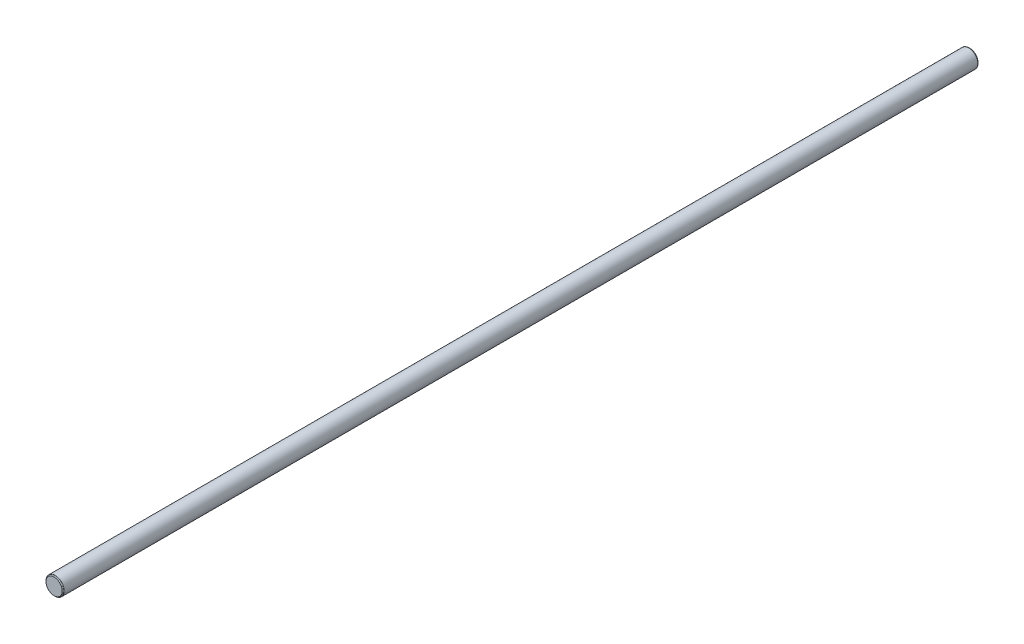
ISO-10303-21;
HEADER;
FILE_DESCRIPTION(('STEP AP214'),'2;1');
FILE_NAME('part.step','',(''),(''),'','','');
FILE_SCHEMA(('AUTOMOTIVE_DESIGN { 1 0 10303 214 1 1 1 1 }'));
ENDSEC;
DATA;
#1=APPLICATION_CONTEXT('core data for automotive mechanical design processes');
#2=APPLICATION_PROTOCOL_DEFINITION('international standard','automotive_design',2000,#1);
#3=PRODUCT_CONTEXT('',#1,'mechanical');
#4=PRODUCT('Part','Part','',(#3));
#5=PRODUCT_RELATED_PRODUCT_CATEGORY('part','',(#4));
#6=PRODUCT_DEFINITION_FORMATION('','',#4);
#7=PRODUCT_DEFINITION_CONTEXT('part definition',#1,'design');
#8=PRODUCT_DEFINITION('design','',#6,#7);
#9=PRODUCT_DEFINITION_SHAPE('','',#8);
#10=(LENGTH_UNIT() NAMED_UNIT(*) SI_UNIT(.MILLI.,.METRE.));
#11=(NAMED_UNIT(*) PLANE_ANGLE_UNIT() SI_UNIT($,.RADIAN.));
#12=(NAMED_UNIT(*) SI_UNIT($,.STERADIAN.) SOLID_ANGLE_UNIT());
#13=UNCERTAINTY_MEASURE_WITH_UNIT(LENGTH_MEASURE(1.E-05),#10,'distance_accuracy_value','');
#14=(GEOMETRIC_REPRESENTATION_CONTEXT(3) GLOBAL_UNCERTAINTY_ASSIGNED_CONTEXT((#13)) GLOBAL_UNIT_ASSIGNED_CONTEXT((#10,
#11,#12)) REPRESENTATION_CONTEXT('',''));
#15=CARTESIAN_POINT('',(0.,0.,0.));
#16=DIRECTION('',(0.,0.,1.));
#17=DIRECTION('',(1.,0.,0.));
#18=AXIS2_PLACEMENT_3D('',#15,#16,#17);
#19=CARTESIAN_POINT('',(0.,0.,152.4));
#20=DIRECTION('',(0.,0.,-1.));
#21=DIRECTION('',(-1.,0.,0.));
#22=AXIS2_PLACEMENT_3D('',#19,#20,#21);
#23=CYLINDRICAL_SURFACE('',#22,3.);
#24=CARTESIAN_POINT('',(0.,0.,-152.006801948466));
#25=DIRECTION('',(0.,0.,-1.));
#26=DIRECTION('',(-1.,0.,0.));
#27=AXIS2_PLACEMENT_3D('',#24,#25,#26);
#28=CIRCLE('',#27,3.);
#29=CARTESIAN_POINT('',(-3.,0.,-152.006801948466));
#30=VERTEX_POINT('',#29);
#31=EDGE_CURVE('E61',#30,#30,#28,.F.);
#32=CARTESIAN_POINT('',(0.,0.,152.006801948466));
#33=DIRECTION('',(0.,0.,1.));
#34=DIRECTION('',(1.,0.,0.));
#35=AXIS2_PLACEMENT_3D('',#32,#33,#34);
#36=CIRCLE('',#35,3.);
#37=CARTESIAN_POINT('',(-3.,0.,152.006801948466));
#38=VERTEX_POINT('',#37);
#39=EDGE_CURVE('E67',#38,#38,#36,.F.);
#40=CARTESIAN_POINT('',(-3.,0.,-152.006801948466));
#41=CARTESIAN_POINT('',(-3.,0.,-148.839993574539));
#42=CARTESIAN_POINT('',(-3.,0.,-145.673185200613));
#43=CARTESIAN_POINT('',(-3.,0.,-139.33956845276));
#44=CARTESIAN_POINT('',(-3.,0.,-136.172760078834));
#45=CARTESIAN_POINT('',(-3.,0.,-129.839143330981));
#46=CARTESIAN_POINT('',(-3.,0.,-126.672334957055));
#47=CARTESIAN_POINT('',(-3.,0.,-120.338718209202));
#48=CARTESIAN_POINT('',(-3.,0.,-117.171909835276));
#49=CARTESIAN_POINT('',(-3.,0.,-110.838293087423));
#50=CARTESIAN_POINT('',(-3.,0.,-107.671484713497));
#51=CARTESIAN_POINT('',(-3.,0.,-101.337867965644));
#52=CARTESIAN_POINT('',(-3.,0.,-98.1710595917174));
#53=CARTESIAN_POINT('',(-3.,0.,-91.8374428438647));
#54=CARTESIAN_POINT('',(-3.,0.,-88.6706344699383));
#55=CARTESIAN_POINT('',(-3.,0.,-82.3370177220855));
#56=CARTESIAN_POINT('',(-3.,0.,-79.1702093481591));
#57=CARTESIAN_POINT('',(-3.,0.,-72.8365926003064));
#58=CARTESIAN_POINT('',(-3.,0.,-69.66978422638));
#59=CARTESIAN_POINT('',(-3.,0.,-63.3361674785273));
#60=CARTESIAN_POINT('',(-3.,0.,-60.1693591046009));
#61=CARTESIAN_POINT('',(-3.,0.,-53.8357423567481));
#62=CARTESIAN_POINT('',(-3.,0.,-50.6689339828218));
#63=CARTESIAN_POINT('',(-3.,0.,-44.335317234969));
#64=CARTESIAN_POINT('',(-3.,0.,-41.1685088610426));
#65=CARTESIAN_POINT('',(-3.,0.,-34.8348921131899));
#66=CARTESIAN_POINT('',(-3.,0.,-31.6680837392635));
#67=CARTESIAN_POINT('',(-3.,0.,-25.3344669914108));
#68=CARTESIAN_POINT('',(-3.,0.,-22.1676586174844));
#69=CARTESIAN_POINT('',(-3.,0.,-15.8340418696316));
#70=CARTESIAN_POINT('',(-3.,0.,-12.6672334957053));
#71=CARTESIAN_POINT('',(-3.,0.,-6.33361674785252));
#72=CARTESIAN_POINT('',(-3.,0.,-3.16680837392615));
#73=CARTESIAN_POINT('',(-3.,0.,3.1668083739266));
#74=CARTESIAN_POINT('',(-3.,0.,6.33361674785297));
#75=CARTESIAN_POINT('',(-3.,0.,12.6672334957057));
#76=CARTESIAN_POINT('',(-3.,0.,15.8340418696321));
#77=CARTESIAN_POINT('',(-3.,0.,22.1676586174848));
#78=CARTESIAN_POINT('',(-3.,0.,25.3344669914112));
#79=CARTESIAN_POINT('',(-3.,0.,31.6680837392639));
#80=CARTESIAN_POINT('',(-3.,0.,34.8348921131903));
#81=CARTESIAN_POINT('',(-3.,0.,41.1685088610431));
#82=CARTESIAN_POINT('',(-3.,0.,44.3353172349695));
#83=CARTESIAN_POINT('',(-3.,0.,50.6689339828222));
#84=CARTESIAN_POINT('',(-3.,0.,53.8357423567486));
#85=CARTESIAN_POINT('',(-3.,0.,60.1693591046013));
#86=CARTESIAN_POINT('',(-3.,0.,63.3361674785277));
#87=CARTESIAN_POINT('',(-3.,0.,69.6697842263805));
#88=CARTESIAN_POINT('',(-3.,0.,72.8365926003068));
#89=CARTESIAN_POINT('',(-3.,0.,79.1702093481596));
#90=CARTESIAN_POINT('',(-3.,0.,82.337017722086));
#91=CARTESIAN_POINT('',(-3.,0.,88.6706344699387));
#92=CARTESIAN_POINT('',(-3.,0.,91.8374428438651));
#93=CARTESIAN_POINT('',(-3.,0.,98.1710595917178));
#94=CARTESIAN_POINT('',(-3.,0.,101.337867965644));
#95=CARTESIAN_POINT('',(-3.,0.,107.671484713497));
#96=CARTESIAN_POINT('',(-3.,0.,110.838293087423));
#97=CARTESIAN_POINT('',(-3.,0.,117.171909835276));
#98=CARTESIAN_POINT('',(-3.,0.,120.338718209202));
#99=CARTESIAN_POINT('',(-3.,0.,126.672334957055));
#100=CARTESIAN_POINT('',(-3.,0.,129.839143330982));
#101=CARTESIAN_POINT('',(-3.,0.,136.172760078834));
#102=CARTESIAN_POINT('',(-3.,0.,139.339568452761));
#103=CARTESIAN_POINT('',(-3.,0.,145.673185200613));
#104=CARTESIAN_POINT('',(-3.,0.,148.83999357454));
#105=CARTESIAN_POINT('',(-3.,0.,152.006801948466));
#106=B_SPLINE_CURVE_WITH_KNOTS('',3,(#40,#41,#42,#43,#44,#45,#46,#47,#48,#49,#50,#51,#52,#53,
#54,#55,#56,#57,#58,#59,#60,#61,#62,#63,#64,#65,#66,#67,#68,#69,#70,#71,#72,#73,#74,#75,#76,#77,
#78,#79,#80,#81,#82,#83,#84,#85,#86,#87,#88,#89,#90,#91,#92,#93,#94,#95,#96,#97,#98,#99,#100,
#101,#102,#103,#104,#105),.UNSPECIFIED.,.F.,.F.,(4,2,2,2,2,2,2,2,2,2,2,2,2,2,2,2,2,2,2,2,2,2,2,
2,2,2,2,2,2,2,2,2,4),(0.,9.50042512177912,19.0008502435582,28.5012753653374,38.0017004871165,
47.5021256088956,57.0025507306747,66.5029758524538,76.003400974233,85.5038260960121,
95.0042512177912,104.50467633957,114.005101461349,123.505526583129,133.005951704908,
142.506376826687,152.006801948466,161.507227070245,171.007652192024,180.508077313803,
190.008502435582,199.508927557362,209.009352679141,218.50977780092,228.010202922699,
237.510628044478,247.011053166257,256.511478288036,266.011903409815,275.512328531595,
285.012753653374,294.513178775153,304.013603896932),.UNSPECIFIED.);
#107=EDGE_CURVE('BSEAM47',#30,#38,#106,.T.);
#108=ORIENTED_EDGE('',*,*,#31,.T.);
#109=ORIENTED_EDGE('',*,*,#39,.T.);
#110=ORIENTED_EDGE('',*,*,#107,.T.);
#111=ORIENTED_EDGE('',*,*,#107,.F.);
#112=EDGE_LOOP('',(#108,#110,#109,#111));
#113=FACE_BOUND('',#112,.T.);
#114=ADVANCED_FACE('F47',(#113),#23,.T.);
#115=CARTESIAN_POINT('',(0.,0.,152.4));
#116=DIRECTION('',(0.,0.,1.));
#117=DIRECTION('',(1.,0.,0.));
#118=AXIS2_PLACEMENT_3D('',#115,#116,#117);
#119=PLANE('',#118);
#120=CARTESIAN_POINT('',(0.,0.,152.4));
#121=DIRECTION('',(0.,0.,1.));
#122=DIRECTION('',(1.,0.,0.));
#123=AXIS2_PLACEMENT_3D('',#120,#121,#122);
#124=CIRCLE('',#123,2.70000000000015);
#125=CARTESIAN_POINT('',(2.70000000000015,0.,152.4));
#126=VERTEX_POINT('',#125);
#127=EDGE_CURVE('E73',#126,#126,#124,.T.);
#128=ORIENTED_EDGE('',*,*,#127,.T.);
#129=EDGE_LOOP('',(#128));
#130=FACE_BOUND('',#129,.T.);
#131=ADVANCED_FACE('F96',(#130),#119,.T.);
#132=CARTESIAN_POINT('',(0.,0.,-152.4));
#133=DIRECTION('',(0.,0.,1.));
#134=DIRECTION('',(1.,0.,0.));
#135=AXIS2_PLACEMENT_3D('',#132,#133,#134);
#136=PLANE('',#135);
#137=CARTESIAN_POINT('',(0.,0.,-152.4));
#138=DIRECTION('',(0.,0.,1.));
#139=DIRECTION('',(1.,0.,0.));
#140=AXIS2_PLACEMENT_3D('',#137,#138,#139);
#141=CIRCLE('',#140,2.69999999999973);
#142=CARTESIAN_POINT('',(2.69999999999973,0.,-152.4));
#143=VERTEX_POINT('',#142);
#144=EDGE_CURVE('E77',#143,#143,#141,.F.);
#145=ORIENTED_EDGE('',*,*,#144,.T.);
#146=EDGE_LOOP('',(#145));
#147=FACE_BOUND('',#146,.T.);
#148=ADVANCED_FACE('F83',(#147),#136,.F.);
#149=CARTESIAN_POINT('',(0.,0.,-152.1));
#150=DIRECTION('',(0.,0.,1.));
#151=DIRECTION('',(1.,0.,0.));
#152=AXIS2_PLACEMENT_3D('',#149,#150,#151);
#153=CONICAL_SURFACE('',#152,3.,0.785398163397492);
#154=CARTESIAN_POINT('',(0.,0.,-152.165900974233));
#155=DIRECTION('',(0.,0.,1.));
#156=DIRECTION('',(1.,0.,0.));
#157=AXIS2_PLACEMENT_3D('',#154,#155,#156);
#158=CIRCLE('',#157,2.93409902576697);
#159=CARTESIAN_POINT('',(2.93409902576697,0.,-152.165900974233));
#160=VERTEX_POINT('',#159);
#161=EDGE_CURVE('E55',#160,#160,#158,.F.);
#162=ORIENTED_EDGE('',*,*,#161,.T.);
#163=EDGE_LOOP('',(#162));
#164=FACE_BOUND('',#163,.T.);
#165=ORIENTED_EDGE('',*,*,#144,.F.);
#166=EDGE_LOOP('',(#165));
#167=FACE_BOUND('',#166,.T.);
#168=ADVANCED_FACE('F85',(#164,#167),#153,.T.);
#169=CARTESIAN_POINT('',(0.,0.,152.4));
#170=DIRECTION('',(0.,0.,-1.));
#171=DIRECTION('',(-1.,0.,0.));
#172=AXIS2_PLACEMENT_3D('',#169,#170,#171);
#173=CONICAL_SURFACE('',#172,2.70000000000015,0.785398163397446);
#174=CARTESIAN_POINT('',(0.,0.,152.165900974233));
#175=DIRECTION('',(0.,0.,-1.));
#176=DIRECTION('',(-1.,0.,0.));
#177=AXIS2_PLACEMENT_3D('',#174,#175,#176);
#178=CIRCLE('',#177,2.93409902576697);
#179=CARTESIAN_POINT('',(-2.93409902576697,0.,152.165900974233));
#180=VERTEX_POINT('',#179);
#181=EDGE_CURVE('E11',#180,#180,#178,.F.);
#182=ORIENTED_EDGE('',*,*,#181,.T.);
#183=EDGE_LOOP('',(#182));
#184=FACE_BOUND('',#183,.T.);
#185=ORIENTED_EDGE('',*,*,#127,.F.);
#186=EDGE_LOOP('',(#185));
#187=FACE_BOUND('',#186,.T.);
#188=ADVANCED_FACE('F87',(#184,#187),#173,.T.);
#189=CARTESIAN_POINT('',(0.,0.,-152.006801948466));
#190=DIRECTION('',(0.,0.,-1.));
#191=DIRECTION('',(-1.,0.,0.));
#192=AXIS2_PLACEMENT_3D('',#189,#190,#191);
#193=TOROIDAL_SURFACE('',#192,2.775,0.225);
#194=ORIENTED_EDGE('',*,*,#161,.F.);
#195=EDGE_LOOP('',(#194));
#196=FACE_BOUND('',#195,.T.);
#197=ORIENTED_EDGE('',*,*,#31,.F.);
#198=EDGE_LOOP('',(#197));
#199=FACE_BOUND('',#198,.T.);
#200=ADVANCED_FACE('F93',(#196,#199),#193,.T.);
#201=CARTESIAN_POINT('',(0.,0.,152.006801948466));
#202=DIRECTION('',(0.,0.,1.));
#203=DIRECTION('',(1.,0.,0.));
#204=AXIS2_PLACEMENT_3D('',#201,#202,#203);
#205=TOROIDAL_SURFACE('',#204,2.775,0.225);
#206=ORIENTED_EDGE('',*,*,#181,.F.);
#207=EDGE_LOOP('',(#206));
#208=FACE_BOUND('',#207,.T.);
#209=ORIENTED_EDGE('',*,*,#39,.F.);
#210=EDGE_LOOP('',(#209));
#211=FACE_BOUND('',#210,.T.);
#212=ADVANCED_FACE('F49',(#208,#211),#205,.T.);
#213=CLOSED_SHELL('',(#114,#131,#148,#168,#188,#200,#212));
#214=MANIFOLD_SOLID_BREP('B2',#213);
#215=ADVANCED_BREP_SHAPE_REPRESENTATION('',(#18,#214),#14);
#216=SHAPE_DEFINITION_REPRESENTATION(#9,#215);
ENDSEC;
END-ISO-10303-21;
